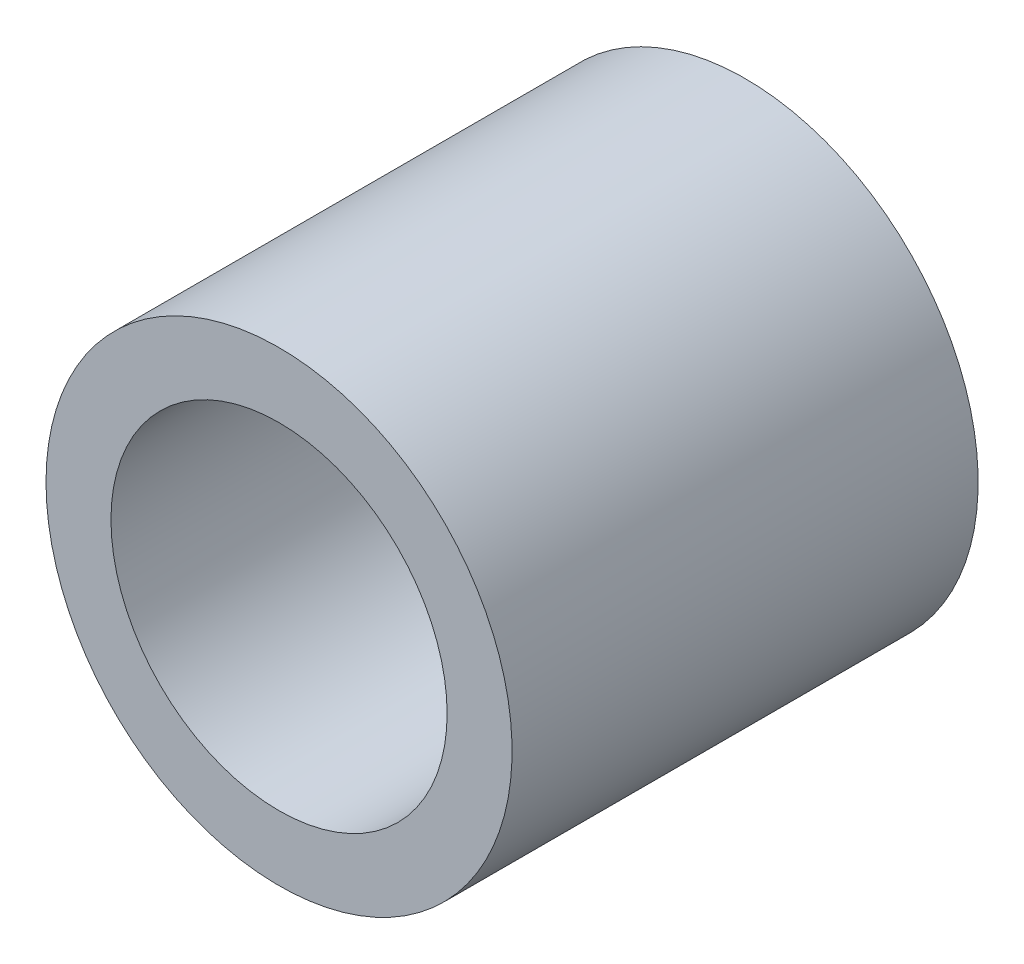
ISO-10303-21;
HEADER;
FILE_DESCRIPTION(('STEP AP214'),'2;1');
FILE_NAME('part.step','',(''),(''),'','','');
FILE_SCHEMA(('AUTOMOTIVE_DESIGN { 1 0 10303 214 1 1 1 1 }'));
ENDSEC;
DATA;
#1=APPLICATION_CONTEXT('core data for automotive mechanical design processes');
#2=APPLICATION_PROTOCOL_DEFINITION('international standard','automotive_design',2000,#1);
#3=PRODUCT_CONTEXT('',#1,'mechanical');
#4=PRODUCT('Part','Part','',(#3));
#5=PRODUCT_RELATED_PRODUCT_CATEGORY('part','',(#4));
#6=PRODUCT_DEFINITION_FORMATION('','',#4);
#7=PRODUCT_DEFINITION_CONTEXT('part definition',#1,'design');
#8=PRODUCT_DEFINITION('design','',#6,#7);
#9=PRODUCT_DEFINITION_SHAPE('','',#8);
#10=(LENGTH_UNIT() NAMED_UNIT(*) SI_UNIT(.MILLI.,.METRE.));
#11=(NAMED_UNIT(*) PLANE_ANGLE_UNIT() SI_UNIT($,.RADIAN.));
#12=(NAMED_UNIT(*) SI_UNIT($,.STERADIAN.) SOLID_ANGLE_UNIT());
#13=UNCERTAINTY_MEASURE_WITH_UNIT(LENGTH_MEASURE(1.E-05),#10,'distance_accuracy_value','');
#14=(GEOMETRIC_REPRESENTATION_CONTEXT(3) GLOBAL_UNCERTAINTY_ASSIGNED_CONTEXT((#13)) GLOBAL_UNIT_ASSIGNED_CONTEXT((#10,
#11,#12)) REPRESENTATION_CONTEXT('',''));
#15=CARTESIAN_POINT('',(0.,0.,0.));
#16=DIRECTION('',(0.,0.,1.));
#17=DIRECTION('',(1.,0.,0.));
#18=AXIS2_PLACEMENT_3D('',#15,#16,#17);
#19=CARTESIAN_POINT('',(0.,0.,19.05));
#20=DIRECTION('',(0.,0.,-1.));
#21=DIRECTION('',(-1.,0.,0.));
#22=AXIS2_PLACEMENT_3D('',#19,#20,#21);
#23=CYLINDRICAL_SURFACE('',#22,6.869999976);
#24=CARTESIAN_POINT('',(0.,0.,0.));
#25=DIRECTION('',(0.,0.,-1.));
#26=DIRECTION('',(-1.,0.,0.));
#27=AXIS2_PLACEMENT_3D('',#24,#25,#26);
#28=CIRCLE('',#27,6.869999976);
#29=CARTESIAN_POINT('',(-6.869999976,0.,0.));
#30=VERTEX_POINT('',#29);
#31=EDGE_CURVE('E27',#30,#30,#28,.T.);
#32=ORIENTED_EDGE('',*,*,#31,.T.);
#33=EDGE_LOOP('',(#32));
#34=FACE_BOUND('',#33,.T.);
#35=CARTESIAN_POINT('',(0.,0.,19.05));
#36=DIRECTION('',(0.,0.,-1.));
#37=DIRECTION('',(-1.,0.,0.));
#38=AXIS2_PLACEMENT_3D('',#35,#36,#37);
#39=CIRCLE('',#38,6.869999976);
#40=CARTESIAN_POINT('',(-6.869999976,0.,19.05));
#41=VERTEX_POINT('',#40);
#42=EDGE_CURVE('E18',#41,#41,#39,.T.);
#43=ORIENTED_EDGE('',*,*,#42,.F.);
#44=EDGE_LOOP('',(#43));
#45=FACE_BOUND('',#44,.T.);
#46=ADVANCED_FACE('F15',(#34,#45),#23,.F.);
#47=CARTESIAN_POINT('',(0.,0.,19.05));
#48=DIRECTION('',(0.,0.,1.));
#49=DIRECTION('',(1.,0.,0.));
#50=AXIS2_PLACEMENT_3D('',#47,#48,#49);
#51=PLANE('',#50);
#52=ORIENTED_EDGE('',*,*,#42,.T.);
#53=EDGE_LOOP('',(#52));
#54=FACE_BOUND('',#53,.T.);
#55=CARTESIAN_POINT('',(0.,0.,19.05));
#56=DIRECTION('',(0.,0.,-1.));
#57=DIRECTION('',(-1.,0.,0.));
#58=AXIS2_PLACEMENT_3D('',#55,#56,#57);
#59=CIRCLE('',#58,9.525);
#60=CARTESIAN_POINT('',(-9.525,0.,19.05));
#61=VERTEX_POINT('',#60);
#62=EDGE_CURVE('E22',#61,#61,#59,.T.);
#63=ORIENTED_EDGE('',*,*,#62,.F.);
#64=EDGE_LOOP('',(#63));
#65=FACE_BOUND('',#64,.T.);
#66=ADVANCED_FACE('F35',(#54,#65),#51,.T.);
#67=CARTESIAN_POINT('',(0.,0.,0.));
#68=DIRECTION('',(0.,0.,1.));
#69=DIRECTION('',(1.,0.,0.));
#70=AXIS2_PLACEMENT_3D('',#67,#68,#69);
#71=PLANE('',#70);
#72=ORIENTED_EDGE('',*,*,#31,.F.);
#73=EDGE_LOOP('',(#72));
#74=FACE_BOUND('',#73,.T.);
#75=CARTESIAN_POINT('',(0.,0.,0.));
#76=DIRECTION('',(0.,0.,-1.));
#77=DIRECTION('',(-1.,0.,0.));
#78=AXIS2_PLACEMENT_3D('',#75,#76,#77);
#79=CIRCLE('',#78,9.525);
#80=CARTESIAN_POINT('',(-9.525,0.,0.));
#81=VERTEX_POINT('',#80);
#82=EDGE_CURVE('E10',#81,#81,#79,.F.);
#83=ORIENTED_EDGE('',*,*,#82,.F.);
#84=EDGE_LOOP('',(#83));
#85=FACE_BOUND('',#84,.T.);
#86=ADVANCED_FACE('F43',(#74,#85),#71,.F.);
#87=CARTESIAN_POINT('',(0.,0.,19.05));
#88=DIRECTION('',(0.,0.,-1.));
#89=DIRECTION('',(-1.,0.,0.));
#90=AXIS2_PLACEMENT_3D('',#87,#88,#89);
#91=CYLINDRICAL_SURFACE('',#90,9.525);
#92=ORIENTED_EDGE('',*,*,#82,.T.);
#93=EDGE_LOOP('',(#92));
#94=FACE_BOUND('',#93,.T.);
#95=ORIENTED_EDGE('',*,*,#62,.T.);
#96=EDGE_LOOP('',(#95));
#97=FACE_BOUND('',#96,.T.);
#98=ADVANCED_FACE('F44',(#94,#97),#91,.T.);
#99=CLOSED_SHELL('',(#46,#66,#86,#98));
#100=MANIFOLD_SOLID_BREP('B1',#99);
#101=ADVANCED_BREP_SHAPE_REPRESENTATION('',(#18,#100),#14);
#102=SHAPE_DEFINITION_REPRESENTATION(#9,#101);
ENDSEC;
END-ISO-10303-21;
